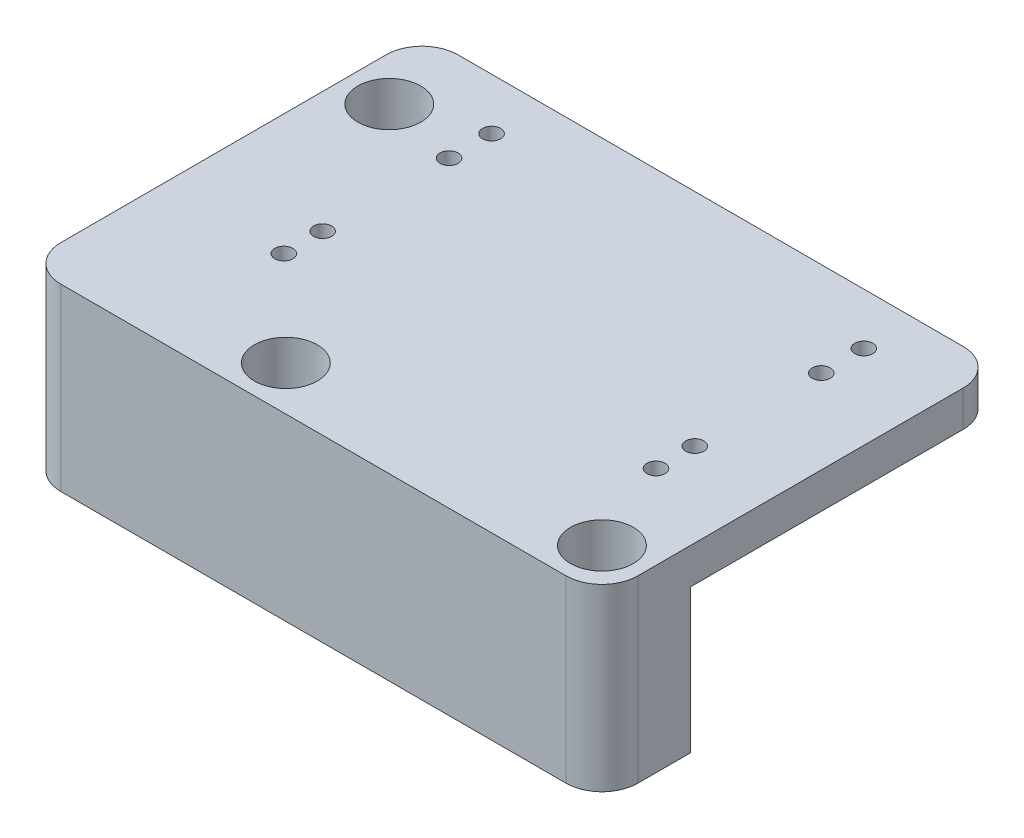
ISO-10303-21;
HEADER;
FILE_DESCRIPTION(('STEP AP214'),'2;1');
FILE_NAME('part.step','',(''),(''),'','','');
FILE_SCHEMA(('AUTOMOTIVE_DESIGN { 1 0 10303 214 1 1 1 1 }'));
ENDSEC;
DATA;
#1=APPLICATION_CONTEXT('core data for automotive mechanical design processes');
#2=APPLICATION_PROTOCOL_DEFINITION('international standard','automotive_design',2000,#1);
#3=PRODUCT_CONTEXT('',#1,'mechanical');
#4=PRODUCT('Part','Part','',(#3));
#5=PRODUCT_RELATED_PRODUCT_CATEGORY('part','',(#4));
#6=PRODUCT_DEFINITION_FORMATION('','',#4);
#7=PRODUCT_DEFINITION_CONTEXT('part definition',#1,'design');
#8=PRODUCT_DEFINITION('design','',#6,#7);
#9=PRODUCT_DEFINITION_SHAPE('','',#8);
#10=(LENGTH_UNIT() NAMED_UNIT(*) SI_UNIT(.MILLI.,.METRE.));
#11=(NAMED_UNIT(*) PLANE_ANGLE_UNIT() SI_UNIT($,.RADIAN.));
#12=(NAMED_UNIT(*) SI_UNIT($,.STERADIAN.) SOLID_ANGLE_UNIT());
#13=UNCERTAINTY_MEASURE_WITH_UNIT(LENGTH_MEASURE(1.E-05),#10,'distance_accuracy_value','');
#14=(GEOMETRIC_REPRESENTATION_CONTEXT(3) GLOBAL_UNCERTAINTY_ASSIGNED_CONTEXT((#13)) GLOBAL_UNIT_ASSIGNED_CONTEXT((#10,
#11,#12)) REPRESENTATION_CONTEXT('',''));
#15=CARTESIAN_POINT('',(0.,0.,0.));
#16=DIRECTION('',(0.,0.,1.));
#17=DIRECTION('',(1.,0.,0.));
#18=AXIS2_PLACEMENT_3D('',#15,#16,#17);
#19=CARTESIAN_POINT('',(0.,0.,0.));
#20=DIRECTION('',(0.,1.,0.));
#21=DIRECTION('',(0.,0.,1.));
#22=AXIS2_PLACEMENT_3D('',#19,#20,#21);
#23=PLANE('',#22);
#24=CARTESIAN_POINT('',(-16.3703,0.,-9.0932));
#25=DIRECTION('',(0.,1.,0.));
#26=DIRECTION('',(0.,0.,1.));
#27=AXIS2_PLACEMENT_3D('',#24,#25,#26);
#28=CIRCLE('',#27,0.799999999999993);
#29=CARTESIAN_POINT('',(-16.3703,0.,-8.29320000000001));
#30=VERTEX_POINT('',#29);
#31=EDGE_CURVE('E287',#30,#30,#28,.T.);
#32=ORIENTED_EDGE('',*,*,#31,.T.);
#33=EDGE_LOOP('',(#32));
#34=FACE_BOUND('',#33,.T.);
#35=CARTESIAN_POINT('',(-16.3703,0.,-5.334));
#36=DIRECTION('',(0.,1.,0.));
#37=DIRECTION('',(0.,0.,1.));
#38=AXIS2_PLACEMENT_3D('',#35,#36,#37);
#39=CIRCLE('',#38,0.799999999999993);
#40=CARTESIAN_POINT('',(-16.3703,0.,-4.53400000000001));
#41=VERTEX_POINT('',#40);
#42=EDGE_CURVE('E248',#41,#41,#39,.T.);
#43=ORIENTED_EDGE('',*,*,#42,.T.);
#44=EDGE_LOOP('',(#43));
#45=FACE_BOUND('',#44,.T.);
#46=CARTESIAN_POINT('',(-16.3703,0.,5.842));
#47=DIRECTION('',(0.,1.,0.));
#48=DIRECTION('',(0.,0.,1.));
#49=AXIS2_PLACEMENT_3D('',#46,#47,#48);
#50=CIRCLE('',#49,0.799999999999993);
#51=CARTESIAN_POINT('',(-16.3703,0.,6.64199999999999));
#52=VERTEX_POINT('',#51);
#53=EDGE_CURVE('E280',#52,#52,#50,.T.);
#54=ORIENTED_EDGE('',*,*,#53,.T.);
#55=EDGE_LOOP('',(#54));
#56=FACE_BOUND('',#55,.T.);
#57=CARTESIAN_POINT('',(-16.3703,0.,9.271));
#58=DIRECTION('',(0.,1.,0.));
#59=DIRECTION('',(0.,0.,1.));
#60=AXIS2_PLACEMENT_3D('',#57,#58,#59);
#61=CIRCLE('',#60,0.799999999999993);
#62=CARTESIAN_POINT('',(-16.3703,0.,10.071));
#63=VERTEX_POINT('',#62);
#64=EDGE_CURVE('E274',#63,#63,#61,.T.);
#65=ORIENTED_EDGE('',*,*,#64,.T.);
#66=EDGE_LOOP('',(#65));
#67=FACE_BOUND('',#66,.T.);
#68=CARTESIAN_POINT('',(16.5227,0.,9.271));
#69=DIRECTION('',(0.,1.,0.));
#70=DIRECTION('',(0.,0.,1.));
#71=AXIS2_PLACEMENT_3D('',#68,#69,#70);
#72=CIRCLE('',#71,0.799999999999993);
#73=CARTESIAN_POINT('',(16.5227,0.,10.071));
#74=VERTEX_POINT('',#73);
#75=EDGE_CURVE('E268',#74,#74,#72,.T.);
#76=ORIENTED_EDGE('',*,*,#75,.T.);
#77=EDGE_LOOP('',(#76));
#78=FACE_BOUND('',#77,.T.);
#79=CARTESIAN_POINT('',(16.5227,0.,5.842));
#80=DIRECTION('',(0.,1.,0.));
#81=DIRECTION('',(0.,0.,1.));
#82=AXIS2_PLACEMENT_3D('',#79,#80,#81);
#83=CIRCLE('',#82,0.799999999999993);
#84=CARTESIAN_POINT('',(16.5227,0.,6.64199999999999));
#85=VERTEX_POINT('',#84);
#86=EDGE_CURVE('E259',#85,#85,#83,.T.);
#87=ORIENTED_EDGE('',*,*,#86,.T.);
#88=EDGE_LOOP('',(#87));
#89=FACE_BOUND('',#88,.T.);
#90=CARTESIAN_POINT('',(16.5227,0.,-5.334));
#91=DIRECTION('',(0.,1.,0.));
#92=DIRECTION('',(0.,0.,1.));
#93=AXIS2_PLACEMENT_3D('',#90,#91,#92);
#94=CIRCLE('',#93,0.799999999999993);
#95=CARTESIAN_POINT('',(16.5227,0.,-4.53400000000001));
#96=VERTEX_POINT('',#95);
#97=EDGE_CURVE('E186',#96,#96,#94,.T.);
#98=ORIENTED_EDGE('',*,*,#97,.T.);
#99=EDGE_LOOP('',(#98));
#100=FACE_BOUND('',#99,.T.);
#101=CARTESIAN_POINT('',(16.5227,0.,-9.0932));
#102=DIRECTION('',(0.,1.,0.));
#103=DIRECTION('',(0.,0.,1.));
#104=AXIS2_PLACEMENT_3D('',#101,#102,#103);
#105=CIRCLE('',#104,0.799999999999993);
#106=CARTESIAN_POINT('',(16.5227,0.,-8.29320000000001));
#107=VERTEX_POINT('',#106);
#108=EDGE_CURVE('E179',#107,#107,#105,.T.);
#109=ORIENTED_EDGE('',*,*,#108,.T.);
#110=EDGE_LOOP('',(#109));
#111=FACE_BOUND('',#110,.T.);
#112=DIRECTION('',(-1.,0.,0.));
#113=VECTOR('',#112,1.);
#114=CARTESIAN_POINT('',(-27.0637,0.,-13.6398));
#115=LINE('',#114,#113);
#116=CARTESIAN_POINT('',(20.7645,0.,-13.6398));
#117=VERTEX_POINT('',#116);
#118=CARTESIAN_POINT('',(-19.2405,0.,-13.6398));
#119=VERTEX_POINT('',#118);
#120=EDGE_CURVE('E140',#117,#119,#115,.T.);
#121=ORIENTED_EDGE('',*,*,#120,.F.);
#122=CARTESIAN_POINT('',(20.7645,0.,-10.4648));
#123=DIRECTION('',(0.,1.,0.));
#124=DIRECTION('',(0.,0.,1.));
#125=AXIS2_PLACEMENT_3D('',#122,#123,#124);
#126=CIRCLE('',#125,3.175);
#127=CARTESIAN_POINT('',(23.9395,0.,-10.4648));
#128=VERTEX_POINT('',#127);
#129=EDGE_CURVE('E48',#117,#128,#126,.F.);
#130=ORIENTED_EDGE('',*,*,#129,.T.);
#131=DIRECTION('',(0.,0.,-1.));
#132=VECTOR('',#131,1.);
#133=CARTESIAN_POINT('',(23.9395,0.,-13.6398));
#134=LINE('',#133,#132);
#135=CARTESIAN_POINT('',(23.9395,0.,13.6398));
#136=VERTEX_POINT('',#135);
#137=EDGE_CURVE('E142',#136,#128,#134,.T.);
#138=ORIENTED_EDGE('',*,*,#137,.F.);
#139=DIRECTION('',(1.,0.,0.));
#140=VECTOR('',#139,1.);
#141=CARTESIAN_POINT('',(23.9395,0.,13.6398));
#142=LINE('',#141,#140);
#143=CARTESIAN_POINT('',(-19.2405,0.,13.6398));
#144=VERTEX_POINT('',#143);
#145=EDGE_CURVE('E126',#144,#136,#142,.T.);
#146=ORIENTED_EDGE('',*,*,#145,.F.);
#147=DIRECTION('',(0.,0.,1.));
#148=VECTOR('',#147,1.);
#149=CARTESIAN_POINT('',(-19.2405,0.,13.6398));
#150=LINE('',#149,#148);
#151=EDGE_CURVE('E157',#119,#144,#150,.T.);
#152=ORIENTED_EDGE('',*,*,#151,.F.);
#153=EDGE_LOOP('',(#121,#130,#138,#146,#152));
#154=FACE_BOUND('',#153,.T.);
#155=ADVANCED_FACE('F33',(#34,#45,#56,#67,#78,#89,#100,#111,#154),#23,.F.);
#156=CARTESIAN_POINT('',(-27.0637,3.175,-13.6398));
#157=DIRECTION('',(1.,0.,0.));
#158=DIRECTION('',(0.,0.,-1.));
#159=AXIS2_PLACEMENT_3D('',#156,#157,#158);
#160=PLANE('',#159);
#161=DIRECTION('',(0.,0.,1.));
#162=VECTOR('',#161,1.);
#163=CARTESIAN_POINT('',(-27.0637,3.175,-13.6398));
#164=LINE('',#163,#162);
#165=CARTESIAN_POINT('',(-27.0637,3.175,-10.4648));
#166=VERTEX_POINT('',#165);
#167=CARTESIAN_POINT('',(-27.0637,3.175,18.288));
#168=VERTEX_POINT('',#167);
#169=EDGE_CURVE('E164',#166,#168,#164,.T.);
#170=ORIENTED_EDGE('',*,*,#169,.F.);
#171=DIRECTION('',(0.,-1.,0.));
#172=VECTOR('',#171,1.);
#173=CARTESIAN_POINT('',(-27.0637,3.175,-10.4648));
#174=LINE('',#173,#172);
#175=CARTESIAN_POINT('',(-27.0637,-12.7,-10.4648));
#176=VERTEX_POINT('',#175);
#177=EDGE_CURVE('E11',#166,#176,#174,.T.);
#178=ORIENTED_EDGE('',*,*,#177,.T.);
#179=DIRECTION('',(0.,0.,-1.));
#180=VECTOR('',#179,1.);
#181=CARTESIAN_POINT('',(-27.0637,-12.7,-13.6398));
#182=LINE('',#181,#180);
#183=CARTESIAN_POINT('',(-27.0637,-12.7,18.288));
#184=VERTEX_POINT('',#183);
#185=EDGE_CURVE('E161',#184,#176,#182,.T.);
#186=ORIENTED_EDGE('',*,*,#185,.F.);
#187=DIRECTION('',(0.,-1.,0.));
#188=VECTOR('',#187,1.);
#189=CARTESIAN_POINT('',(-27.0637,3.175,18.288));
#190=LINE('',#189,#188);
#191=EDGE_CURVE('E41',#184,#168,#190,.F.);
#192=ORIENTED_EDGE('',*,*,#191,.T.);
#193=EDGE_LOOP('',(#170,#178,#186,#192));
#194=FACE_BOUND('',#193,.T.);
#195=ADVANCED_FACE('F354',(#194),#160,.F.);
#196=CARTESIAN_POINT('',(-27.0637,3.175,21.463));
#197=DIRECTION('',(0.,0.,-1.));
#198=DIRECTION('',(-1.,0.,0.));
#199=AXIS2_PLACEMENT_3D('',#196,#197,#198);
#200=PLANE('',#199);
#201=DIRECTION('',(-1.,0.,0.));
#202=VECTOR('',#201,1.);
#203=CARTESIAN_POINT('',(-27.0637,-12.7,21.463));
#204=LINE('',#203,#202);
#205=CARTESIAN_POINT('',(20.7645,-12.7,21.463));
#206=VERTEX_POINT('',#205);
#207=CARTESIAN_POINT('',(-23.8887,-12.7,21.463));
#208=VERTEX_POINT('',#207);
#209=EDGE_CURVE('E192',#206,#208,#204,.T.);
#210=ORIENTED_EDGE('',*,*,#209,.F.);
#211=DIRECTION('',(0.,-1.,0.));
#212=VECTOR('',#211,1.);
#213=CARTESIAN_POINT('',(20.7645,3.175,21.463));
#214=LINE('',#213,#212);
#215=CARTESIAN_POINT('',(20.7645,3.175,21.463));
#216=VERTEX_POINT('',#215);
#217=EDGE_CURVE('E220',#206,#216,#214,.F.);
#218=ORIENTED_EDGE('',*,*,#217,.T.);
#219=DIRECTION('',(1.,0.,0.));
#220=VECTOR('',#219,1.);
#221=CARTESIAN_POINT('',(-27.0637,3.175,21.463));
#222=LINE('',#221,#220);
#223=CARTESIAN_POINT('',(-23.8887,3.175,21.463));
#224=VERTEX_POINT('',#223);
#225=EDGE_CURVE('E167',#224,#216,#222,.T.);
#226=ORIENTED_EDGE('',*,*,#225,.F.);
#227=DIRECTION('',(0.,-1.,0.));
#228=VECTOR('',#227,1.);
#229=CARTESIAN_POINT('',(-23.8887,3.175,21.463));
#230=LINE('',#229,#228);
#231=EDGE_CURVE('E222',#224,#208,#230,.T.);
#232=ORIENTED_EDGE('',*,*,#231,.T.);
#233=EDGE_LOOP('',(#210,#218,#226,#232));
#234=FACE_BOUND('',#233,.T.);
#235=ADVANCED_FACE('F349',(#234),#200,.F.);
#236=CARTESIAN_POINT('',(23.9395,3.175,-13.6398));
#237=DIRECTION('',(-1.,0.,0.));
#238=DIRECTION('',(0.,0.,1.));
#239=AXIS2_PLACEMENT_3D('',#236,#237,#238);
#240=PLANE('',#239);
#241=DIRECTION('',(0.,0.,-1.));
#242=VECTOR('',#241,1.);
#243=CARTESIAN_POINT('',(23.9395,3.175,-13.6398));
#244=LINE('',#243,#242);
#245=CARTESIAN_POINT('',(23.9395,3.175,18.288));
#246=VERTEX_POINT('',#245);
#247=CARTESIAN_POINT('',(23.9395,3.175,-10.4648));
#248=VERTEX_POINT('',#247);
#249=EDGE_CURVE('E170',#246,#248,#244,.T.);
#250=ORIENTED_EDGE('',*,*,#249,.F.);
#251=DIRECTION('',(0.,-1.,0.));
#252=VECTOR('',#251,1.);
#253=CARTESIAN_POINT('',(23.9395,3.175,18.288));
#254=LINE('',#253,#252);
#255=CARTESIAN_POINT('',(23.9395,-12.7,18.288));
#256=VERTEX_POINT('',#255);
#257=EDGE_CURVE('E230',#246,#256,#254,.T.);
#258=ORIENTED_EDGE('',*,*,#257,.T.);
#259=DIRECTION('',(0.,0.,1.));
#260=VECTOR('',#259,1.);
#261=CARTESIAN_POINT('',(23.9395,-12.7,21.463));
#262=LINE('',#261,#260);
#263=CARTESIAN_POINT('',(23.9395,-12.7,13.6398));
#264=VERTEX_POINT('',#263);
#265=EDGE_CURVE('E191',#264,#256,#262,.T.);
#266=ORIENTED_EDGE('',*,*,#265,.F.);
#267=DIRECTION('',(0.,1.,0.));
#268=VECTOR('',#267,1.);
#269=CARTESIAN_POINT('',(23.9395,-12.7,13.6398));
#270=LINE('',#269,#268);
#271=EDGE_CURVE('E146',#264,#136,#270,.T.);
#272=ORIENTED_EDGE('',*,*,#271,.T.);
#273=ORIENTED_EDGE('',*,*,#137,.T.);
#274=DIRECTION('',(0.,-1.,0.));
#275=VECTOR('',#274,1.);
#276=CARTESIAN_POINT('',(23.9395,3.175,-10.4648));
#277=LINE('',#276,#275);
#278=EDGE_CURVE('E175',#128,#248,#277,.F.);
#279=ORIENTED_EDGE('',*,*,#278,.T.);
#280=EDGE_LOOP('',(#250,#258,#266,#272,#273,#279));
#281=FACE_BOUND('',#280,.T.);
#282=ADVANCED_FACE('F201',(#281),#240,.F.);
#283=CARTESIAN_POINT('',(-27.0637,3.175,-13.6398));
#284=DIRECTION('',(0.,0.,1.));
#285=DIRECTION('',(1.,0.,0.));
#286=AXIS2_PLACEMENT_3D('',#283,#284,#285);
#287=PLANE('',#286);
#288=DIRECTION('',(-1.,0.,0.));
#289=VECTOR('',#288,1.);
#290=CARTESIAN_POINT('',(-27.0637,3.175,-13.6398));
#291=LINE('',#290,#289);
#292=CARTESIAN_POINT('',(20.7645,3.175,-13.6398));
#293=VERTEX_POINT('',#292);
#294=CARTESIAN_POINT('',(-23.8887,3.175,-13.6398));
#295=VERTEX_POINT('',#294);
#296=EDGE_CURVE('E173',#293,#295,#291,.T.);
#297=ORIENTED_EDGE('',*,*,#296,.F.);
#298=DIRECTION('',(0.,-1.,0.));
#299=VECTOR('',#298,1.);
#300=CARTESIAN_POINT('',(20.7645,3.175,-13.6398));
#301=LINE('',#300,#299);
#302=EDGE_CURVE('E206',#293,#117,#301,.T.);
#303=ORIENTED_EDGE('',*,*,#302,.T.);
#304=ORIENTED_EDGE('',*,*,#120,.T.);
#305=DIRECTION('',(0.,1.,0.));
#306=VECTOR('',#305,1.);
#307=CARTESIAN_POINT('',(-19.2405,-12.7,-13.6398));
#308=LINE('',#307,#306);
#309=CARTESIAN_POINT('',(-19.2405,-12.7,-13.6398));
#310=VERTEX_POINT('',#309);
#311=EDGE_CURVE('E132',#310,#119,#308,.T.);
#312=ORIENTED_EDGE('',*,*,#311,.F.);
#313=DIRECTION('',(1.,0.,0.));
#314=VECTOR('',#313,1.);
#315=CARTESIAN_POINT('',(-19.2405,-12.7,-13.6398));
#316=LINE('',#315,#314);
#317=CARTESIAN_POINT('',(-23.8887,-12.7,-13.6398));
#318=VERTEX_POINT('',#317);
#319=EDGE_CURVE('E117',#318,#310,#316,.T.);
#320=ORIENTED_EDGE('',*,*,#319,.F.);
#321=DIRECTION('',(0.,-1.,0.));
#322=VECTOR('',#321,1.);
#323=CARTESIAN_POINT('',(-23.8887,3.175,-13.6398));
#324=LINE('',#323,#322);
#325=EDGE_CURVE('E56',#318,#295,#324,.F.);
#326=ORIENTED_EDGE('',*,*,#325,.T.);
#327=EDGE_LOOP('',(#297,#303,#304,#312,#320,#326));
#328=FACE_BOUND('',#327,.T.);
#329=ADVANCED_FACE('F138',(#328),#287,.F.);
#330=CARTESIAN_POINT('',(0.,3.175,0.));
#331=DIRECTION('',(0.,1.,0.));
#332=DIRECTION('',(0.,0.,1.));
#333=AXIS2_PLACEMENT_3D('',#330,#331,#332);
#334=PLANE('',#333);
#335=CARTESIAN_POINT('',(-23.1521,3.175,-6.8326));
#336=DIRECTION('',(0.,1.,0.));
#337=DIRECTION('',(0.,0.,1.));
#338=AXIS2_PLACEMENT_3D('',#335,#336,#337);
#339=CIRCLE('',#338,2.77876);
#340=CARTESIAN_POINT('',(-23.1521,3.175,-4.05384));
#341=VERTEX_POINT('',#340);
#342=EDGE_CURVE('E311',#341,#341,#339,.T.);
#343=ORIENTED_EDGE('',*,*,#342,.F.);
#344=EDGE_LOOP('',(#343));
#345=FACE_BOUND('',#344,.T.);
#346=CARTESIAN_POINT('',(-7.91209999999999,3.175,17.5514));
#347=DIRECTION('',(0.,1.,0.));
#348=DIRECTION('',(0.,0.,1.));
#349=AXIS2_PLACEMENT_3D('',#346,#347,#348);
#350=CIRCLE('',#349,2.77876);
#351=CARTESIAN_POINT('',(-7.91209999999999,3.175,20.33016));
#352=VERTEX_POINT('',#351);
#353=EDGE_CURVE('E236',#352,#352,#350,.T.);
#354=ORIENTED_EDGE('',*,*,#353,.F.);
#355=EDGE_LOOP('',(#354));
#356=FACE_BOUND('',#355,.T.);
#357=CARTESIAN_POINT('',(20.0279,3.175,17.5514));
#358=DIRECTION('',(0.,1.,0.));
#359=DIRECTION('',(0.,0.,1.));
#360=AXIS2_PLACEMENT_3D('',#357,#358,#359);
#361=CIRCLE('',#360,2.77876);
#362=CARTESIAN_POINT('',(20.0279,3.175,20.33016));
#363=VERTEX_POINT('',#362);
#364=EDGE_CURVE('E241',#363,#363,#361,.T.);
#365=ORIENTED_EDGE('',*,*,#364,.F.);
#366=EDGE_LOOP('',(#365));
#367=FACE_BOUND('',#366,.T.);
#368=CARTESIAN_POINT('',(-16.3703,3.175,-9.0932));
#369=DIRECTION('',(0.,1.,0.));
#370=DIRECTION('',(0.,0.,1.));
#371=AXIS2_PLACEMENT_3D('',#368,#369,#370);
#372=CIRCLE('',#371,0.799999999999988);
#373=CARTESIAN_POINT('',(-16.3703,3.175,-8.29320000000001));
#374=VERTEX_POINT('',#373);
#375=EDGE_CURVE('E246',#374,#374,#372,.T.);
#376=ORIENTED_EDGE('',*,*,#375,.F.);
#377=EDGE_LOOP('',(#376));
#378=FACE_BOUND('',#377,.T.);
#379=CARTESIAN_POINT('',(-16.3703,3.175,-5.334));
#380=DIRECTION('',(0.,1.,0.));
#381=DIRECTION('',(0.,0.,1.));
#382=AXIS2_PLACEMENT_3D('',#379,#380,#381);
#383=CIRCLE('',#382,0.799999999999988);
#384=CARTESIAN_POINT('',(-16.3703,3.175,-4.53400000000001));
#385=VERTEX_POINT('',#384);
#386=EDGE_CURVE('E252',#385,#385,#383,.T.);
#387=ORIENTED_EDGE('',*,*,#386,.F.);
#388=EDGE_LOOP('',(#387));
#389=FACE_BOUND('',#388,.T.);
#390=CARTESIAN_POINT('',(-16.3703,3.175,5.842));
#391=DIRECTION('',(0.,1.,0.));
#392=DIRECTION('',(0.,0.,1.));
#393=AXIS2_PLACEMENT_3D('',#390,#391,#392);
#394=CIRCLE('',#393,0.799999999999988);
#395=CARTESIAN_POINT('',(-16.3703,3.175,6.64199999999999));
#396=VERTEX_POINT('',#395);
#397=EDGE_CURVE('E251',#396,#396,#394,.T.);
#398=ORIENTED_EDGE('',*,*,#397,.F.);
#399=EDGE_LOOP('',(#398));
#400=FACE_BOUND('',#399,.T.);
#401=CARTESIAN_POINT('',(-16.3703,3.175,9.271));
#402=DIRECTION('',(0.,1.,0.));
#403=DIRECTION('',(0.,0.,1.));
#404=AXIS2_PLACEMENT_3D('',#401,#402,#403);
#405=CIRCLE('',#404,0.799999999999988);
#406=CARTESIAN_POINT('',(-16.3703,3.175,10.071));
#407=VERTEX_POINT('',#406);
#408=EDGE_CURVE('E277',#407,#407,#405,.T.);
#409=ORIENTED_EDGE('',*,*,#408,.F.);
#410=EDGE_LOOP('',(#409));
#411=FACE_BOUND('',#410,.T.);
#412=CARTESIAN_POINT('',(16.5227,3.175,9.271));
#413=DIRECTION('',(0.,1.,0.));
#414=DIRECTION('',(0.,0.,1.));
#415=AXIS2_PLACEMENT_3D('',#412,#413,#414);
#416=CIRCLE('',#415,0.799999999999988);
#417=CARTESIAN_POINT('',(16.5227,3.175,10.071));
#418=VERTEX_POINT('',#417);
#419=EDGE_CURVE('E271',#418,#418,#416,.T.);
#420=ORIENTED_EDGE('',*,*,#419,.F.);
#421=EDGE_LOOP('',(#420));
#422=FACE_BOUND('',#421,.T.);
#423=CARTESIAN_POINT('',(16.5227,3.175,5.842));
#424=DIRECTION('',(0.,1.,0.));
#425=DIRECTION('',(0.,0.,1.));
#426=AXIS2_PLACEMENT_3D('',#423,#424,#425);
#427=CIRCLE('',#426,0.799999999999988);
#428=CARTESIAN_POINT('',(16.5227,3.175,6.64199999999999));
#429=VERTEX_POINT('',#428);
#430=EDGE_CURVE('E263',#429,#429,#427,.T.);
#431=ORIENTED_EDGE('',*,*,#430,.F.);
#432=EDGE_LOOP('',(#431));
#433=FACE_BOUND('',#432,.T.);
#434=CARTESIAN_POINT('',(16.5227,3.175,-5.334));
#435=DIRECTION('',(0.,1.,0.));
#436=DIRECTION('',(0.,0.,1.));
#437=AXIS2_PLACEMENT_3D('',#434,#435,#436);
#438=CIRCLE('',#437,0.799999999999988);
#439=CARTESIAN_POINT('',(16.5227,3.175,-4.53400000000001));
#440=VERTEX_POINT('',#439);
#441=EDGE_CURVE('E254',#440,#440,#438,.T.);
#442=ORIENTED_EDGE('',*,*,#441,.F.);
#443=EDGE_LOOP('',(#442));
#444=FACE_BOUND('',#443,.T.);
#445=CARTESIAN_POINT('',(16.5227,3.175,-9.0932));
#446=DIRECTION('',(0.,1.,0.));
#447=DIRECTION('',(0.,0.,1.));
#448=AXIS2_PLACEMENT_3D('',#445,#446,#447);
#449=CIRCLE('',#448,0.799999999999988);
#450=CARTESIAN_POINT('',(16.5227,3.175,-8.29320000000001));
#451=VERTEX_POINT('',#450);
#452=EDGE_CURVE('E181',#451,#451,#449,.T.);
#453=ORIENTED_EDGE('',*,*,#452,.F.);
#454=EDGE_LOOP('',(#453));
#455=FACE_BOUND('',#454,.T.);
#456=ORIENTED_EDGE('',*,*,#225,.T.);
#457=CARTESIAN_POINT('',(20.7645,3.175,18.288));
#458=DIRECTION('',(0.,1.,0.));
#459=DIRECTION('',(0.,0.,1.));
#460=AXIS2_PLACEMENT_3D('',#457,#458,#459);
#461=CIRCLE('',#460,3.175);
#462=EDGE_CURVE('E211',#216,#246,#461,.T.);
#463=ORIENTED_EDGE('',*,*,#462,.T.);
#464=ORIENTED_EDGE('',*,*,#249,.T.);
#465=CARTESIAN_POINT('',(20.7645,3.175,-10.4648));
#466=DIRECTION('',(0.,1.,0.));
#467=DIRECTION('',(0.,0.,1.));
#468=AXIS2_PLACEMENT_3D('',#465,#466,#467);
#469=CIRCLE('',#468,3.175);
#470=EDGE_CURVE('E214',#248,#293,#469,.T.);
#471=ORIENTED_EDGE('',*,*,#470,.T.);
#472=ORIENTED_EDGE('',*,*,#296,.T.);
#473=CARTESIAN_POINT('',(-23.8887,3.175,-10.4648));
#474=DIRECTION('',(0.,1.,0.));
#475=DIRECTION('',(0.,0.,1.));
#476=AXIS2_PLACEMENT_3D('',#473,#474,#475);
#477=CIRCLE('',#476,3.175);
#478=EDGE_CURVE('E216',#295,#166,#477,.T.);
#479=ORIENTED_EDGE('',*,*,#478,.T.);
#480=ORIENTED_EDGE('',*,*,#169,.T.);
#481=CARTESIAN_POINT('',(-23.8887,3.175,18.288));
#482=DIRECTION('',(0.,1.,0.));
#483=DIRECTION('',(0.,0.,1.));
#484=AXIS2_PLACEMENT_3D('',#481,#482,#483);
#485=CIRCLE('',#484,3.175);
#486=EDGE_CURVE('E218',#168,#224,#485,.T.);
#487=ORIENTED_EDGE('',*,*,#486,.T.);
#488=EDGE_LOOP('',(#456,#463,#464,#471,#472,#479,#480,#487));
#489=FACE_BOUND('',#488,.T.);
#490=ADVANCED_FACE('F317',(#345,#356,#367,#378,#389,#400,#411,#422,#433,#444,#455,#489),#334,.T.);
#491=CARTESIAN_POINT('',(-19.2405,-12.7,13.6398));
#492=DIRECTION('',(-1.,0.,0.));
#493=DIRECTION('',(0.,0.,1.));
#494=AXIS2_PLACEMENT_3D('',#491,#492,#493);
#495=PLANE('',#494);
#496=ORIENTED_EDGE('',*,*,#151,.T.);
#497=DIRECTION('',(0.,1.,0.));
#498=VECTOR('',#497,1.);
#499=CARTESIAN_POINT('',(-19.2405,-12.7,13.6398));
#500=LINE('',#499,#498);
#501=CARTESIAN_POINT('',(-19.2405,-12.7,13.6398));
#502=VERTEX_POINT('',#501);
#503=EDGE_CURVE('E134',#502,#144,#500,.T.);
#504=ORIENTED_EDGE('',*,*,#503,.F.);
#505=DIRECTION('',(0.,0.,1.));
#506=VECTOR('',#505,1.);
#507=CARTESIAN_POINT('',(-19.2405,-12.7,13.6398));
#508=LINE('',#507,#506);
#509=EDGE_CURVE('E121',#310,#502,#508,.T.);
#510=ORIENTED_EDGE('',*,*,#509,.F.);
#511=ORIENTED_EDGE('',*,*,#311,.T.);
#512=EDGE_LOOP('',(#496,#504,#510,#511));
#513=FACE_BOUND('',#512,.T.);
#514=ADVANCED_FACE('F131',(#513),#495,.F.);
#515=CARTESIAN_POINT('',(23.9395,-12.7,13.6398));
#516=DIRECTION('',(0.,0.,1.));
#517=DIRECTION('',(1.,0.,0.));
#518=AXIS2_PLACEMENT_3D('',#515,#516,#517);
#519=PLANE('',#518);
#520=ORIENTED_EDGE('',*,*,#145,.T.);
#521=ORIENTED_EDGE('',*,*,#271,.F.);
#522=DIRECTION('',(1.,0.,0.));
#523=VECTOR('',#522,1.);
#524=CARTESIAN_POINT('',(23.9395,-12.7,13.6398));
#525=LINE('',#524,#523);
#526=EDGE_CURVE('E136',#502,#264,#525,.T.);
#527=ORIENTED_EDGE('',*,*,#526,.F.);
#528=ORIENTED_EDGE('',*,*,#503,.T.);
#529=EDGE_LOOP('',(#520,#521,#527,#528));
#530=FACE_BOUND('',#529,.T.);
#531=ADVANCED_FACE('F204',(#530),#519,.F.);
#532=CARTESIAN_POINT('',(0.,-12.7,0.));
#533=DIRECTION('',(0.,1.,0.));
#534=DIRECTION('',(0.,0.,1.));
#535=AXIS2_PLACEMENT_3D('',#532,#533,#534);
#536=PLANE('',#535);
#537=CARTESIAN_POINT('',(-23.1521,-12.7,-6.8326));
#538=DIRECTION('',(0.,1.,0.));
#539=DIRECTION('',(0.,0.,1.));
#540=AXIS2_PLACEMENT_3D('',#537,#538,#539);
#541=CIRCLE('',#540,1.63195);
#542=CARTESIAN_POINT('',(-23.1521,-12.7,-5.20065));
#543=VERTEX_POINT('',#542);
#544=EDGE_CURVE('E233',#543,#543,#541,.T.);
#545=ORIENTED_EDGE('',*,*,#544,.T.);
#546=EDGE_LOOP('',(#545));
#547=FACE_BOUND('',#546,.T.);
#548=CARTESIAN_POINT('',(-7.91209999999999,-12.7,17.5514));
#549=DIRECTION('',(0.,1.,0.));
#550=DIRECTION('',(0.,0.,1.));
#551=AXIS2_PLACEMENT_3D('',#548,#549,#550);
#552=CIRCLE('',#551,1.63195);
#553=CARTESIAN_POINT('',(-7.91209999999999,-12.7,19.18335));
#554=VERTEX_POINT('',#553);
#555=EDGE_CURVE('E238',#554,#554,#552,.T.);
#556=ORIENTED_EDGE('',*,*,#555,.T.);
#557=EDGE_LOOP('',(#556));
#558=FACE_BOUND('',#557,.T.);
#559=CARTESIAN_POINT('',(20.0279,-12.7,17.5514));
#560=DIRECTION('',(0.,1.,0.));
#561=DIRECTION('',(0.,0.,1.));
#562=AXIS2_PLACEMENT_3D('',#559,#560,#561);
#563=CIRCLE('',#562,1.63195);
#564=CARTESIAN_POINT('',(20.0279,-12.7,19.18335));
#565=VERTEX_POINT('',#564);
#566=EDGE_CURVE('E243',#565,#565,#563,.T.);
#567=ORIENTED_EDGE('',*,*,#566,.T.);
#568=EDGE_LOOP('',(#567));
#569=FACE_BOUND('',#568,.T.);
#570=ORIENTED_EDGE('',*,*,#265,.T.);
#571=CARTESIAN_POINT('',(20.7645,-12.7,18.288));
#572=DIRECTION('',(0.,1.,0.));
#573=DIRECTION('',(0.,0.,1.));
#574=AXIS2_PLACEMENT_3D('',#571,#572,#573);
#575=CIRCLE('',#574,3.175);
#576=EDGE_CURVE('E225',#256,#206,#575,.F.);
#577=ORIENTED_EDGE('',*,*,#576,.T.);
#578=ORIENTED_EDGE('',*,*,#209,.T.);
#579=CARTESIAN_POINT('',(-23.8887,-12.7,18.288));
#580=DIRECTION('',(0.,1.,0.));
#581=DIRECTION('',(0.,0.,1.));
#582=AXIS2_PLACEMENT_3D('',#579,#580,#581);
#583=CIRCLE('',#582,3.175);
#584=EDGE_CURVE('E228',#208,#184,#583,.F.);
#585=ORIENTED_EDGE('',*,*,#584,.T.);
#586=ORIENTED_EDGE('',*,*,#185,.T.);
#587=CARTESIAN_POINT('',(-23.8887,-12.7,-10.4648));
#588=DIRECTION('',(0.,1.,0.));
#589=DIRECTION('',(0.,0.,1.));
#590=AXIS2_PLACEMENT_3D('',#587,#588,#589);
#591=CIRCLE('',#590,3.175);
#592=EDGE_CURVE('E124',#176,#318,#591,.F.);
#593=ORIENTED_EDGE('',*,*,#592,.T.);
#594=ORIENTED_EDGE('',*,*,#319,.T.);
#595=ORIENTED_EDGE('',*,*,#509,.T.);
#596=ORIENTED_EDGE('',*,*,#526,.T.);
#597=EDGE_LOOP('',(#570,#577,#578,#585,#586,#593,#594,#595,#596));
#598=FACE_BOUND('',#597,.T.);
#599=ADVANCED_FACE('F120',(#547,#558,#569,#598),#536,.F.);
#600=CARTESIAN_POINT('',(16.5227,3.175,-9.0932));
#601=DIRECTION('',(0.,1.,0.));
#602=DIRECTION('',(0.,0.,1.));
#603=AXIS2_PLACEMENT_3D('',#600,#601,#602);
#604=CYLINDRICAL_SURFACE('',#603,0.799999999999993);
#605=ORIENTED_EDGE('',*,*,#452,.T.);
#606=EDGE_LOOP('',(#605));
#607=FACE_BOUND('',#606,.T.);
#608=ORIENTED_EDGE('',*,*,#108,.F.);
#609=EDGE_LOOP('',(#608));
#610=FACE_BOUND('',#609,.T.);
#611=ADVANCED_FACE('F417',(#607,#610),#604,.F.);
#612=CARTESIAN_POINT('',(16.5227,3.175,-5.334));
#613=DIRECTION('',(0.,1.,0.));
#614=DIRECTION('',(0.,0.,1.));
#615=AXIS2_PLACEMENT_3D('',#612,#613,#614);
#616=CYLINDRICAL_SURFACE('',#615,0.799999999999993);
#617=ORIENTED_EDGE('',*,*,#441,.T.);
#618=EDGE_LOOP('',(#617));
#619=FACE_BOUND('',#618,.T.);
#620=ORIENTED_EDGE('',*,*,#97,.F.);
#621=EDGE_LOOP('',(#620));
#622=FACE_BOUND('',#621,.T.);
#623=ADVANCED_FACE('F425',(#619,#622),#616,.F.);
#624=CARTESIAN_POINT('',(16.5227,3.175,5.842));
#625=DIRECTION('',(0.,1.,0.));
#626=DIRECTION('',(0.,0.,1.));
#627=AXIS2_PLACEMENT_3D('',#624,#625,#626);
#628=CYLINDRICAL_SURFACE('',#627,0.799999999999993);
#629=ORIENTED_EDGE('',*,*,#430,.T.);
#630=EDGE_LOOP('',(#629));
#631=FACE_BOUND('',#630,.T.);
#632=ORIENTED_EDGE('',*,*,#86,.F.);
#633=EDGE_LOOP('',(#632));
#634=FACE_BOUND('',#633,.T.);
#635=ADVANCED_FACE('F433',(#631,#634),#628,.F.);
#636=CARTESIAN_POINT('',(16.5227,3.175,9.271));
#637=DIRECTION('',(0.,1.,0.));
#638=DIRECTION('',(0.,0.,1.));
#639=AXIS2_PLACEMENT_3D('',#636,#637,#638);
#640=CYLINDRICAL_SURFACE('',#639,0.799999999999993);
#641=ORIENTED_EDGE('',*,*,#419,.T.);
#642=EDGE_LOOP('',(#641));
#643=FACE_BOUND('',#642,.T.);
#644=ORIENTED_EDGE('',*,*,#75,.F.);
#645=EDGE_LOOP('',(#644));
#646=FACE_BOUND('',#645,.T.);
#647=ADVANCED_FACE('F440',(#643,#646),#640,.F.);
#648=CARTESIAN_POINT('',(-16.3703,3.175,9.271));
#649=DIRECTION('',(0.,1.,0.));
#650=DIRECTION('',(0.,0.,1.));
#651=AXIS2_PLACEMENT_3D('',#648,#649,#650);
#652=CYLINDRICAL_SURFACE('',#651,0.799999999999993);
#653=ORIENTED_EDGE('',*,*,#408,.T.);
#654=EDGE_LOOP('',(#653));
#655=FACE_BOUND('',#654,.T.);
#656=ORIENTED_EDGE('',*,*,#64,.F.);
#657=EDGE_LOOP('',(#656));
#658=FACE_BOUND('',#657,.T.);
#659=ADVANCED_FACE('F448',(#655,#658),#652,.F.);
#660=CARTESIAN_POINT('',(-16.3703,3.175,5.842));
#661=DIRECTION('',(0.,1.,0.));
#662=DIRECTION('',(0.,0.,1.));
#663=AXIS2_PLACEMENT_3D('',#660,#661,#662);
#664=CYLINDRICAL_SURFACE('',#663,0.799999999999993);
#665=ORIENTED_EDGE('',*,*,#397,.T.);
#666=EDGE_LOOP('',(#665));
#667=FACE_BOUND('',#666,.T.);
#668=ORIENTED_EDGE('',*,*,#53,.F.);
#669=EDGE_LOOP('',(#668));
#670=FACE_BOUND('',#669,.T.);
#671=ADVANCED_FACE('F456',(#667,#670),#664,.F.);
#672=CARTESIAN_POINT('',(-16.3703,3.175,-5.334));
#673=DIRECTION('',(0.,1.,0.));
#674=DIRECTION('',(0.,0.,1.));
#675=AXIS2_PLACEMENT_3D('',#672,#673,#674);
#676=CYLINDRICAL_SURFACE('',#675,0.799999999999993);
#677=ORIENTED_EDGE('',*,*,#386,.T.);
#678=EDGE_LOOP('',(#677));
#679=FACE_BOUND('',#678,.T.);
#680=ORIENTED_EDGE('',*,*,#42,.F.);
#681=EDGE_LOOP('',(#680));
#682=FACE_BOUND('',#681,.T.);
#683=ADVANCED_FACE('F464',(#679,#682),#676,.F.);
#684=CARTESIAN_POINT('',(-16.3703,3.175,-9.0932));
#685=DIRECTION('',(0.,1.,0.));
#686=DIRECTION('',(0.,0.,1.));
#687=AXIS2_PLACEMENT_3D('',#684,#685,#686);
#688=CYLINDRICAL_SURFACE('',#687,0.799999999999993);
#689=ORIENTED_EDGE('',*,*,#375,.T.);
#690=EDGE_LOOP('',(#689));
#691=FACE_BOUND('',#690,.T.);
#692=ORIENTED_EDGE('',*,*,#31,.F.);
#693=EDGE_LOOP('',(#692));
#694=FACE_BOUND('',#693,.T.);
#695=ADVANCED_FACE('F472',(#691,#694),#688,.F.);
#696=CARTESIAN_POINT('',(20.0279,3.175,17.5514));
#697=DIRECTION('',(0.,1.,0.));
#698=DIRECTION('',(0.,0.,1.));
#699=AXIS2_PLACEMENT_3D('',#696,#697,#698);
#700=CYLINDRICAL_SURFACE('',#699,1.63195);
#701=CARTESIAN_POINT('',(20.0279,-9.3218,17.5514));
#702=DIRECTION('',(0.,1.,0.));
#703=DIRECTION('',(0.,0.,1.));
#704=AXIS2_PLACEMENT_3D('',#701,#702,#703);
#705=CIRCLE('',#704,1.63195);
#706=CARTESIAN_POINT('',(20.0279,-9.3218,19.18335));
#707=VERTEX_POINT('',#706);
#708=EDGE_CURVE('E247',#707,#707,#705,.T.);
#709=ORIENTED_EDGE('',*,*,#708,.T.);
#710=EDGE_LOOP('',(#709));
#711=FACE_BOUND('',#710,.T.);
#712=ORIENTED_EDGE('',*,*,#566,.F.);
#713=EDGE_LOOP('',(#712));
#714=FACE_BOUND('',#713,.T.);
#715=ADVANCED_FACE('F480',(#711,#714),#700,.F.);
#716=CARTESIAN_POINT('',(21.65985,-9.3218,17.5514));
#717=DIRECTION('',(0.,-1.,0.));
#718=DIRECTION('',(0.,0.,-1.));
#719=AXIS2_PLACEMENT_3D('',#716,#717,#718);
#720=PLANE('',#719);
#721=ORIENTED_EDGE('',*,*,#708,.F.);
#722=EDGE_LOOP('',(#721));
#723=FACE_BOUND('',#722,.T.);
#724=CARTESIAN_POINT('',(20.0279,-9.3218,17.5514));
#725=DIRECTION('',(0.,1.,0.));
#726=DIRECTION('',(0.,0.,1.));
#727=AXIS2_PLACEMENT_3D('',#724,#725,#726);
#728=CIRCLE('',#727,2.77876);
#729=CARTESIAN_POINT('',(20.0279,-9.3218,20.33016));
#730=VERTEX_POINT('',#729);
#731=EDGE_CURVE('E294',#730,#730,#728,.T.);
#732=ORIENTED_EDGE('',*,*,#731,.T.);
#733=EDGE_LOOP('',(#732));
#734=FACE_BOUND('',#733,.T.);
#735=ADVANCED_FACE('F488',(#723,#734),#720,.F.);
#736=CARTESIAN_POINT('',(20.0279,3.175,17.5514));
#737=DIRECTION('',(0.,1.,0.));
#738=DIRECTION('',(0.,0.,1.));
#739=AXIS2_PLACEMENT_3D('',#736,#737,#738);
#740=CYLINDRICAL_SURFACE('',#739,2.77876);
#741=ORIENTED_EDGE('',*,*,#731,.F.);
#742=EDGE_LOOP('',(#741));
#743=FACE_BOUND('',#742,.T.);
#744=ORIENTED_EDGE('',*,*,#364,.T.);
#745=EDGE_LOOP('',(#744));
#746=FACE_BOUND('',#745,.T.);
#747=ADVANCED_FACE('F496',(#743,#746),#740,.F.);
#748=CARTESIAN_POINT('',(-7.91209999999999,3.175,17.5514));
#749=DIRECTION('',(0.,1.,0.));
#750=DIRECTION('',(0.,0.,1.));
#751=AXIS2_PLACEMENT_3D('',#748,#749,#750);
#752=CYLINDRICAL_SURFACE('',#751,1.63195);
#753=CARTESIAN_POINT('',(-7.91209999999999,-9.3218,17.5514));
#754=DIRECTION('',(0.,1.,0.));
#755=DIRECTION('',(0.,0.,1.));
#756=AXIS2_PLACEMENT_3D('',#753,#754,#755);
#757=CIRCLE('',#756,1.63195);
#758=CARTESIAN_POINT('',(-7.91209999999999,-9.3218,19.18335));
#759=VERTEX_POINT('',#758);
#760=EDGE_CURVE('E242',#759,#759,#757,.T.);
#761=ORIENTED_EDGE('',*,*,#760,.T.);
#762=EDGE_LOOP('',(#761));
#763=FACE_BOUND('',#762,.T.);
#764=ORIENTED_EDGE('',*,*,#555,.F.);
#765=EDGE_LOOP('',(#764));
#766=FACE_BOUND('',#765,.T.);
#767=ADVANCED_FACE('F504',(#763,#766),#752,.F.);
#768=CARTESIAN_POINT('',(-6.28014999999999,-9.3218,17.5514));
#769=DIRECTION('',(0.,-1.,0.));
#770=DIRECTION('',(0.,0.,-1.));
#771=AXIS2_PLACEMENT_3D('',#768,#769,#770);
#772=PLANE('',#771);
#773=ORIENTED_EDGE('',*,*,#760,.F.);
#774=EDGE_LOOP('',(#773));
#775=FACE_BOUND('',#774,.T.);
#776=CARTESIAN_POINT('',(-7.91209999999999,-9.3218,17.5514));
#777=DIRECTION('',(0.,1.,0.));
#778=DIRECTION('',(0.,0.,1.));
#779=AXIS2_PLACEMENT_3D('',#776,#777,#778);
#780=CIRCLE('',#779,2.77876);
#781=CARTESIAN_POINT('',(-7.91209999999999,-9.3218,20.33016));
#782=VERTEX_POINT('',#781);
#783=EDGE_CURVE('E301',#782,#782,#780,.T.);
#784=ORIENTED_EDGE('',*,*,#783,.T.);
#785=EDGE_LOOP('',(#784));
#786=FACE_BOUND('',#785,.T.);
#787=ADVANCED_FACE('F512',(#775,#786),#772,.F.);
#788=CARTESIAN_POINT('',(-7.91209999999999,3.175,17.5514));
#789=DIRECTION('',(0.,1.,0.));
#790=DIRECTION('',(0.,0.,1.));
#791=AXIS2_PLACEMENT_3D('',#788,#789,#790);
#792=CYLINDRICAL_SURFACE('',#791,2.77876);
#793=ORIENTED_EDGE('',*,*,#783,.F.);
#794=EDGE_LOOP('',(#793));
#795=FACE_BOUND('',#794,.T.);
#796=ORIENTED_EDGE('',*,*,#353,.T.);
#797=EDGE_LOOP('',(#796));
#798=FACE_BOUND('',#797,.T.);
#799=ADVANCED_FACE('F520',(#795,#798),#792,.F.);
#800=CARTESIAN_POINT('',(-23.1521,3.175,-6.8326));
#801=DIRECTION('',(0.,1.,0.));
#802=DIRECTION('',(0.,0.,1.));
#803=AXIS2_PLACEMENT_3D('',#800,#801,#802);
#804=CYLINDRICAL_SURFACE('',#803,1.63195);
#805=CARTESIAN_POINT('',(-23.1521,-9.3218,-6.8326));
#806=DIRECTION('',(0.,1.,0.));
#807=DIRECTION('',(0.,0.,1.));
#808=AXIS2_PLACEMENT_3D('',#805,#806,#807);
#809=CIRCLE('',#808,1.63195);
#810=CARTESIAN_POINT('',(-23.1521,-9.3218,-5.20065));
#811=VERTEX_POINT('',#810);
#812=EDGE_CURVE('E237',#811,#811,#809,.T.);
#813=ORIENTED_EDGE('',*,*,#812,.T.);
#814=EDGE_LOOP('',(#813));
#815=FACE_BOUND('',#814,.T.);
#816=ORIENTED_EDGE('',*,*,#544,.F.);
#817=EDGE_LOOP('',(#816));
#818=FACE_BOUND('',#817,.T.);
#819=ADVANCED_FACE('F528',(#815,#818),#804,.F.);
#820=CARTESIAN_POINT('',(-21.52015,-9.3218,-6.8326));
#821=DIRECTION('',(0.,-1.,0.));
#822=DIRECTION('',(0.,0.,-1.));
#823=AXIS2_PLACEMENT_3D('',#820,#821,#822);
#824=PLANE('',#823);
#825=ORIENTED_EDGE('',*,*,#812,.F.);
#826=EDGE_LOOP('',(#825));
#827=FACE_BOUND('',#826,.T.);
#828=CARTESIAN_POINT('',(-23.1521,-9.3218,-6.8326));
#829=DIRECTION('',(0.,1.,0.));
#830=DIRECTION('',(0.,0.,1.));
#831=AXIS2_PLACEMENT_3D('',#828,#829,#830);
#832=CIRCLE('',#831,2.77876);
#833=CARTESIAN_POINT('',(-23.1521,-9.3218,-4.05384));
#834=VERTEX_POINT('',#833);
#835=EDGE_CURVE('E308',#834,#834,#832,.T.);
#836=ORIENTED_EDGE('',*,*,#835,.T.);
#837=EDGE_LOOP('',(#836));
#838=FACE_BOUND('',#837,.T.);
#839=ADVANCED_FACE('F536',(#827,#838),#824,.F.);
#840=CARTESIAN_POINT('',(-23.1521,3.175,-6.8326));
#841=DIRECTION('',(0.,1.,0.));
#842=DIRECTION('',(0.,0.,1.));
#843=AXIS2_PLACEMENT_3D('',#840,#841,#842);
#844=CYLINDRICAL_SURFACE('',#843,2.77876);
#845=ORIENTED_EDGE('',*,*,#835,.F.);
#846=EDGE_LOOP('',(#845));
#847=FACE_BOUND('',#846,.T.);
#848=ORIENTED_EDGE('',*,*,#342,.T.);
#849=EDGE_LOOP('',(#848));
#850=FACE_BOUND('',#849,.T.);
#851=ADVANCED_FACE('F315',(#847,#850),#844,.F.);
#852=CARTESIAN_POINT('',(20.7645,3.175,18.288));
#853=DIRECTION('',(0.,-1.,0.));
#854=DIRECTION('',(0.,0.,-1.));
#855=AXIS2_PLACEMENT_3D('',#852,#853,#854);
#856=CYLINDRICAL_SURFACE('',#855,3.175);
#857=ORIENTED_EDGE('',*,*,#462,.F.);
#858=ORIENTED_EDGE('',*,*,#217,.F.);
#859=ORIENTED_EDGE('',*,*,#576,.F.);
#860=ORIENTED_EDGE('',*,*,#257,.F.);
#861=EDGE_LOOP('',(#857,#858,#859,#860));
#862=FACE_BOUND('',#861,.T.);
#863=ADVANCED_FACE('F348',(#862),#856,.T.);
#864=CARTESIAN_POINT('',(20.7645,3.175,-10.4648));
#865=DIRECTION('',(0.,-1.,0.));
#866=DIRECTION('',(0.,0.,-1.));
#867=AXIS2_PLACEMENT_3D('',#864,#865,#866);
#868=CYLINDRICAL_SURFACE('',#867,3.175);
#869=ORIENTED_EDGE('',*,*,#470,.F.);
#870=ORIENTED_EDGE('',*,*,#278,.F.);
#871=ORIENTED_EDGE('',*,*,#129,.F.);
#872=ORIENTED_EDGE('',*,*,#302,.F.);
#873=EDGE_LOOP('',(#869,#870,#871,#872));
#874=FACE_BOUND('',#873,.T.);
#875=ADVANCED_FACE('F360',(#874),#868,.T.);
#876=CARTESIAN_POINT('',(-23.8887,3.175,-10.4648));
#877=DIRECTION('',(0.,-1.,0.));
#878=DIRECTION('',(0.,0.,-1.));
#879=AXIS2_PLACEMENT_3D('',#876,#877,#878);
#880=CYLINDRICAL_SURFACE('',#879,3.175);
#881=ORIENTED_EDGE('',*,*,#478,.F.);
#882=ORIENTED_EDGE('',*,*,#325,.F.);
#883=ORIENTED_EDGE('',*,*,#592,.F.);
#884=ORIENTED_EDGE('',*,*,#177,.F.);
#885=EDGE_LOOP('',(#881,#882,#883,#884));
#886=FACE_BOUND('',#885,.T.);
#887=ADVANCED_FACE('F358',(#886),#880,.T.);
#888=CARTESIAN_POINT('',(-23.8887,3.175,18.288));
#889=DIRECTION('',(0.,-1.,0.));
#890=DIRECTION('',(0.,0.,-1.));
#891=AXIS2_PLACEMENT_3D('',#888,#889,#890);
#892=CYLINDRICAL_SURFACE('',#891,3.175);
#893=ORIENTED_EDGE('',*,*,#486,.F.);
#894=ORIENTED_EDGE('',*,*,#191,.F.);
#895=ORIENTED_EDGE('',*,*,#584,.F.);
#896=ORIENTED_EDGE('',*,*,#231,.F.);
#897=EDGE_LOOP('',(#893,#894,#895,#896));
#898=FACE_BOUND('',#897,.T.);
#899=ADVANCED_FACE('F35',(#898),#892,.T.);
#900=CLOSED_SHELL('',(#155,#195,#235,#282,#329,#490,#514,#531,#599,#611,#623,#635,#647,#659,
#671,#683,#695,#715,#735,#747,#767,#787,#799,#819,#839,#851,#863,#875,#887,#899));
#901=MANIFOLD_SOLID_BREP('B2',#900);
#902=ADVANCED_BREP_SHAPE_REPRESENTATION('',(#18,#901),#14);
#903=SHAPE_DEFINITION_REPRESENTATION(#9,#902);
ENDSEC;
END-ISO-10303-21;
